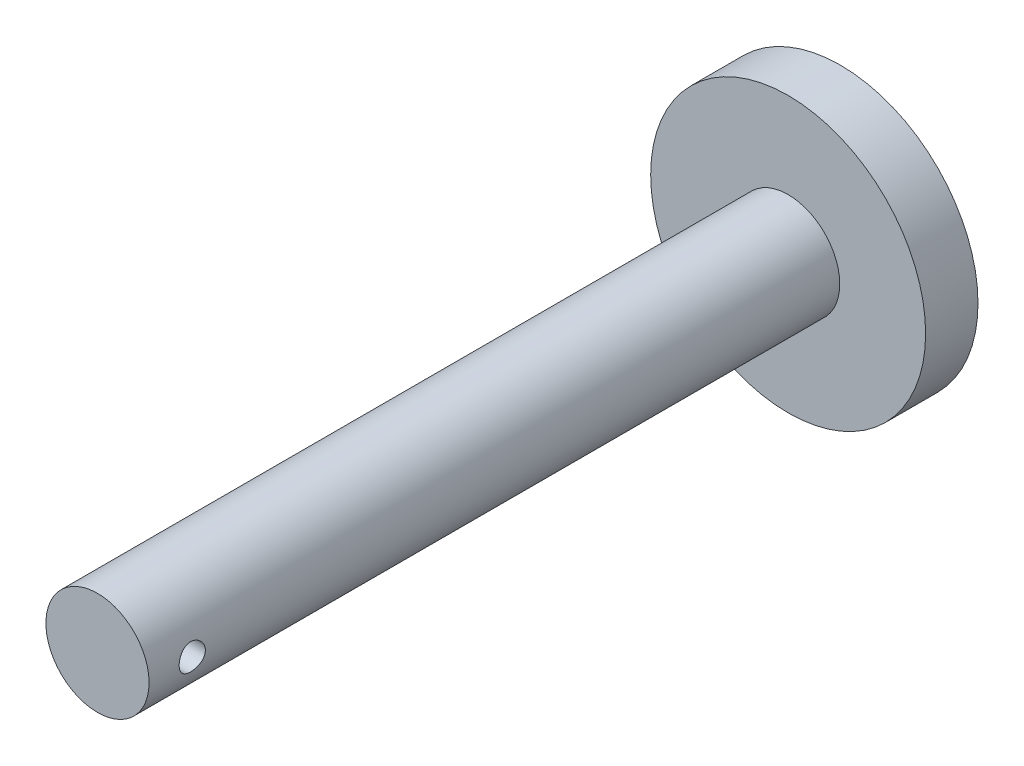
ISO-10303-21;
HEADER;
FILE_DESCRIPTION(('STEP AP214'),'2;1');
FILE_NAME('part.step','',(''),(''),'','','');
FILE_SCHEMA(('AUTOMOTIVE_DESIGN { 1 0 10303 214 1 1 1 1 }'));
ENDSEC;
DATA;
#1=APPLICATION_CONTEXT('core data for automotive mechanical design processes');
#2=APPLICATION_PROTOCOL_DEFINITION('international standard','automotive_design',2000,#1);
#3=PRODUCT_CONTEXT('',#1,'mechanical');
#4=PRODUCT('Part','Part','',(#3));
#5=PRODUCT_RELATED_PRODUCT_CATEGORY('part','',(#4));
#6=PRODUCT_DEFINITION_FORMATION('','',#4);
#7=PRODUCT_DEFINITION_CONTEXT('part definition',#1,'design');
#8=PRODUCT_DEFINITION('design','',#6,#7);
#9=PRODUCT_DEFINITION_SHAPE('','',#8);
#10=(LENGTH_UNIT() NAMED_UNIT(*) SI_UNIT(.MILLI.,.METRE.));
#11=(NAMED_UNIT(*) PLANE_ANGLE_UNIT() SI_UNIT($,.RADIAN.));
#12=(NAMED_UNIT(*) SI_UNIT($,.STERADIAN.) SOLID_ANGLE_UNIT());
#13=UNCERTAINTY_MEASURE_WITH_UNIT(LENGTH_MEASURE(1.E-05),#10,'distance_accuracy_value','');
#14=(GEOMETRIC_REPRESENTATION_CONTEXT(3) GLOBAL_UNCERTAINTY_ASSIGNED_CONTEXT((#13)) GLOBAL_UNIT_ASSIGNED_CONTEXT((#10,
#11,#12)) REPRESENTATION_CONTEXT('',''));
#15=CARTESIAN_POINT('',(0.,0.,0.));
#16=DIRECTION('',(0.,0.,1.));
#17=DIRECTION('',(1.,0.,0.));
#18=AXIS2_PLACEMENT_3D('',#15,#16,#17);
#19=CARTESIAN_POINT('',(0.000165779483992838,-0.000157565610184323,20309.6868082879));
#20=DIRECTION('',(0.,0.,-1.));
#21=DIRECTION('',(-1.,0.,0.));
#22=AXIS2_PLACEMENT_3D('',#19,#20,#21);
#23=CYLINDRICAL_SURFACE('',#22,7.88);
#24=CARTESIAN_POINT('',(0.000165779483992838,-0.000157565610184323,20309.6868082879));
#25=DIRECTION('',(0.,0.,1.));
#26=DIRECTION('',(1.,0.,0.));
#27=AXIS2_PLACEMENT_3D('',#24,#25,#26);
#28=CIRCLE('',#27,7.88);
#29=CARTESIAN_POINT('',(7.88016577948399,-0.000157565610184323,20309.6868082879));
#30=VERTEX_POINT('',#29);
#31=EDGE_CURVE('E60',#30,#30,#28,.T.);
#32=ORIENTED_EDGE('',*,*,#31,.F.);
#33=EDGE_LOOP('',(#32));
#34=FACE_BOUND('',#33,.T.);
#35=CARTESIAN_POINT('',(0.000165779483992838,-0.000157565610184323,20204.1868082879));
#36=DIRECTION('',(0.,0.,1.));
#37=DIRECTION('',(1.,0.,0.));
#38=AXIS2_PLACEMENT_3D('',#35,#36,#37);
#39=CIRCLE('',#38,7.88);
#40=CARTESIAN_POINT('',(7.88016577948399,-0.000157565610184323,20204.1868082879));
#41=VERTEX_POINT('',#40);
#42=EDGE_CURVE('E10',#41,#41,#39,.T.);
#43=ORIENTED_EDGE('',*,*,#42,.T.);
#44=EDGE_LOOP('',(#43));
#45=FACE_BOUND('',#44,.T.);
#46=CARTESIAN_POINT('',(7.88016577948399,-0.000157565610184323,20305.0868082879));
#47=CARTESIAN_POINT('',(7.8801639505477,-0.11060389295446,20305.0868052895));
#48=CARTESIAN_POINT('',(7.87782067920207,-0.221083395842065,20305.0776287398));
#49=CARTESIAN_POINT('',(7.868700075676,-0.438872419070673,20305.0412221994));
#50=CARTESIAN_POINT('',(7.86192031530747,-0.546180169806826,20305.0139823221));
#51=CARTESIAN_POINT('',(7.84467694111426,-0.754449477640841,20304.9423822201));
#52=CARTESIAN_POINT('',(7.83421782575516,-0.855418607632927,20304.8980428952));
#53=CARTESIAN_POINT('',(7.81072772562159,-1.04848603559215,20304.7935769453));
#54=CARTESIAN_POINT('',(7.79769663489274,-1.14058396787119,20304.7334496699));
#55=CARTESIAN_POINT('',(7.7701669908987,-1.3152450590804,20304.5977697663));
#56=CARTESIAN_POINT('',(7.7556452435888,-1.39759358895058,20304.5219455396));
#57=CARTESIAN_POINT('',(7.72692390425617,-1.54855236694292,20304.3576053948));
#58=CARTESIAN_POINT('',(7.71272434987646,-1.61716101703723,20304.2690880024));
#59=CARTESIAN_POINT('',(7.68602053200648,-1.73971015543918,20304.0801972938));
#60=CARTESIAN_POINT('',(7.67354567384372,-1.79340903147545,20303.9796626877));
#61=CARTESIAN_POINT('',(7.65204257439644,-1.88305998987957,20303.7706252483));
#62=CARTESIAN_POINT('',(7.64301376350046,-1.91901500549192,20303.6621237353));
#63=CARTESIAN_POINT('',(7.62966365966066,-1.97142246570708,20303.4425963372));
#64=CARTESIAN_POINT('',(7.62524918924553,-1.98826154700934,20303.3316685528));
#65=CARTESIAN_POINT('',(7.62134879948078,-2.00316369935246,20303.1084814174));
#66=CARTESIAN_POINT('',(7.62186205205088,-2.00122992508127,20302.9962222933));
#67=CARTESIAN_POINT('',(7.627675438462,-1.9789493972136,20302.7765344119));
#68=CARTESIAN_POINT('',(7.63285538134892,-1.95906493877917,20302.6690550898));
#69=CARTESIAN_POINT('',(7.64722675496454,-1.90218561248836,20302.4590101087));
#70=CARTESIAN_POINT('',(7.65641847927216,-1.86518949240256,20302.3564448098));
#71=CARTESIAN_POINT('',(7.67788701948207,-1.77474693847048,20302.1579074408));
#72=CARTESIAN_POINT('',(7.69019481860399,-1.72113400564288,20302.0620147096));
#73=CARTESIAN_POINT('',(7.71649142609444,-1.599096078945,20301.8804217516));
#74=CARTESIAN_POINT('',(7.73048053669731,-1.53066842018696,20301.794723363));
#75=CARTESIAN_POINT('',(7.75906832750519,-1.37855570373589,20301.6333042643));
#76=CARTESIAN_POINT('',(7.77367283214472,-1.29448094643592,20301.5579513442));
#77=CARTESIAN_POINT('',(7.80147512755084,-1.11471236454757,20301.4223431503));
#78=CARTESIAN_POINT('',(7.81467287270407,-1.01901816342064,20301.3620883659));
#79=CARTESIAN_POINT('',(7.83824362865038,-0.818192353623417,20301.2582458564));
#80=CARTESIAN_POINT('',(7.84860621793596,-0.71302776662787,20301.2147193904));
#81=CARTESIAN_POINT('',(7.86526340732067,-0.49655220250099,20301.1460664058));
#82=CARTESIAN_POINT('',(7.8715588101432,-0.385242442926588,20301.1209362563));
#83=CARTESIAN_POINT('',(7.87925293311794,-0.162779463350305,20301.0903544652));
#84=CARTESIAN_POINT('',(7.88077620790448,-0.0516992759932855,20301.0844021532));
#85=CARTESIAN_POINT('',(7.87910994445882,0.16987050825311,20301.0909696851));
#86=CARTESIAN_POINT('',(7.87592084437138,0.280360159090502,20301.1034878116));
#87=CARTESIAN_POINT('',(7.86526812603708,0.495862145796184,20301.1462286159));
#88=CARTESIAN_POINT('',(7.85787082226189,0.600932500356216,20301.1761767894));
#89=CARTESIAN_POINT('',(7.83963655659401,0.80455153022279,20301.2526128589));
#90=CARTESIAN_POINT('',(7.82879924129123,0.903099534197,20301.2991024543));
#91=CARTESIAN_POINT('',(7.80459019068577,1.09285807261905,20301.4082626783));
#92=CARTESIAN_POINT('',(7.79117598774214,1.1839027744315,20301.4712119351));
#93=CARTESIAN_POINT('',(7.76336582823959,1.35431381311217,20301.6111497638));
#94=CARTESIAN_POINT('',(7.74896969705962,1.4336780648236,20301.6881408371));
#95=CARTESIAN_POINT('',(7.72036761637792,1.58054906572546,20301.8563042682));
#96=CARTESIAN_POINT('',(7.70617574527498,1.64770412214792,20301.9477867126));
#97=CARTESIAN_POINT('',(7.67999498580157,1.76571081443749,20302.1410164365));
#98=CARTESIAN_POINT('',(7.668006000471,1.81656316794209,20302.2427632639));
#99=CARTESIAN_POINT('',(7.64772211415523,1.90014043370978,20302.4530941167));
#100=CARTESIAN_POINT('',(7.63940542426869,1.93297255624245,20302.5616333288));
#101=CARTESIAN_POINT('',(7.62739004612696,1.97985423335701,20302.7829354134));
#102=CARTESIAN_POINT('',(7.62369031073617,1.99390804695257,20302.8956973222));
#103=CARTESIAN_POINT('',(7.62140928629254,2.00260652406708,20303.1186603322));
#104=CARTESIAN_POINT('',(7.62267957705745,1.99781397552431,20303.228838305));
#105=CARTESIAN_POINT('',(7.62985135087338,1.97024769660075,20303.4467598908));
#106=CARTESIAN_POINT('',(7.63575273525955,1.94747434929852,20303.5545035557));
#107=CARTESIAN_POINT('',(7.65143775831948,1.88490462404311,20303.7638646678));
#108=CARTESIAN_POINT('',(7.66119659749916,1.84521686346384,20303.8655165629));
#109=CARTESIAN_POINT('',(7.68349976303871,1.75003038756696,20304.0607925577));
#110=CARTESIAN_POINT('',(7.69604448732491,1.69452941322304,20304.154415508));
#111=CARTESIAN_POINT('',(7.7229265881556,1.56754074672777,20304.3336881936));
#112=CARTESIAN_POINT('',(7.73730304001701,1.49566398142429,20304.4190565114));
#113=CARTESIAN_POINT('',(7.76599891836162,1.33871818854384,20304.576703082));
#114=CARTESIAN_POINT('',(7.78031833042098,1.25364601756355,20304.6489782068));
#115=CARTESIAN_POINT('',(7.80760855419452,1.07079142643727,20304.779715915));
#116=CARTESIAN_POINT('',(7.82054890394318,0.972799883569238,20304.837892864));
#117=CARTESIAN_POINT('',(7.84329909953431,0.768106581896936,20304.9368551137));
#118=CARTESIAN_POINT('',(7.85311113572446,0.661410983427605,20304.9776525898));
#119=CARTESIAN_POINT('',(7.86708879772856,0.462432112320536,20305.0348045617));
#120=CARTESIAN_POINT('',(7.87195852977112,0.371077439371159,20305.0542631188));
#121=CARTESIAN_POINT('',(7.87849766507626,0.186437111928176,20305.0802657314));
#122=CARTESIAN_POINT('',(7.88016732463762,0.0931516126824051,20305.0868108212));
#123=CARTESIAN_POINT('',(7.88016577948399,-0.000157565610184323,20305.0868082879));
#124=B_SPLINE_CURVE_WITH_KNOTS('',3,(#46,#47,#48,#49,#50,#51,#52,#53,#54,#55,#56,#57,#58,#59,
#60,#61,#62,#63,#64,#65,#66,#67,#68,#69,#70,#71,#72,#73,#74,#75,#76,#77,#78,#79,#80,#81,#82,#83,
#84,#85,#86,#87,#88,#89,#90,#91,#92,#93,#94,#95,#96,#97,#98,#99,#100,#101,#102,#103,#104,#105,
#106,#107,#108,#109,#110,#111,#112,#113,#114,#115,#116,#117,#118,#119,#120,#121,#122,#123),
.UNSPECIFIED.,.T.,.F.,(4,2,2,2,2,2,2,2,2,2,2,2,2,2,2,2,2,2,2,2,2,2,2,2,2,2,2,2,2,2,2,2,2,2,2,2,
2,2,4),(0.,0.330996984017648,0.662175281664649,0.99295007221282,1.32373849211415,
1.66081750016805,1.99793568972977,2.34023447620484,2.68247665816356,3.01766596186309,
3.35279893958984,3.67953979502001,4.0063045650922,4.33645554552678,4.66666596326695,
5.00659274627279,5.34653054785383,5.68770160390691,6.02880530388397,6.36092853645745,
6.69302089099087,7.02001948669635,7.34705168752963,7.68002532360291,8.01305832915785,
8.35453589856561,8.69599843422306,9.03540680837821,9.37473818995554,9.70401457654512,
10.0332839481337,10.3604700129934,10.6877028420881,11.0237178895982,11.3598131057395,
11.7022353217701,12.0444172552143,12.3240782568286,12.6037168590226),.UNSPECIFIED.);
#125=CARTESIAN_POINT('',(7.88016577948399,-0.000157565610184323,20305.0868082879));
#126=VERTEX_POINT('',#125);
#127=EDGE_CURVE('E63',#126,#126,#124,.T.);
#128=ORIENTED_EDGE('',*,*,#127,.F.);
#129=EDGE_LOOP('',(#128));
#130=FACE_BOUND('',#129,.T.);
#131=CARTESIAN_POINT('',(-7.87983422051601,-0.000157565610184323,20305.0868082879));
#132=CARTESIAN_POINT('',(-7.87983239157971,0.110288761734091,20305.0868052895));
#133=CARTESIAN_POINT('',(-7.87748912023409,0.220768264621696,20305.0776287398));
#134=CARTESIAN_POINT('',(-7.86836851670801,0.438557287850305,20305.0412221994));
#135=CARTESIAN_POINT('',(-7.86158875633948,0.545865038586457,20305.0139823221));
#136=CARTESIAN_POINT('',(-7.84434538214628,0.754134346420472,20304.9423822201));
#137=CARTESIAN_POINT('',(-7.83388626678717,0.855103476412558,20304.8980428952));
#138=CARTESIAN_POINT('',(-7.81039616665361,1.04817090437179,20304.7935769453));
#139=CARTESIAN_POINT('',(-7.79736507592476,1.14026883665082,20304.7334496699));
#140=CARTESIAN_POINT('',(-7.76983543193072,1.31492992786003,20304.5977697663));
#141=CARTESIAN_POINT('',(-7.75531368462081,1.39727845773021,20304.5219455396));
#142=CARTESIAN_POINT('',(-7.72659234528818,1.54823723572255,20304.3576053948));
#143=CARTESIAN_POINT('',(-7.71239279090847,1.61684588581687,20304.2690880024));
#144=CARTESIAN_POINT('',(-7.6856889730385,1.73939502421882,20304.0801972938));
#145=CARTESIAN_POINT('',(-7.67321411487573,1.79309390025508,20303.9796626877));
#146=CARTESIAN_POINT('',(-7.65171101542845,1.88274485865921,20303.7706252483));
#147=CARTESIAN_POINT('',(-7.64268220453248,1.91869987427155,20303.6621237353));
#148=CARTESIAN_POINT('',(-7.62933210069268,1.97110733448671,20303.4425963372));
#149=CARTESIAN_POINT('',(-7.62491763027755,1.98794641578897,20303.3316685528));
#150=CARTESIAN_POINT('',(-7.62101724051279,2.0028485681321,20303.1084814174));
#151=CARTESIAN_POINT('',(-7.62153049308289,2.00091479386091,20302.9962222933));
#152=CARTESIAN_POINT('',(-7.62734387949401,1.97863426599324,20302.7765344119));
#153=CARTESIAN_POINT('',(-7.63252382238094,1.9587498075588,20302.6690550898));
#154=CARTESIAN_POINT('',(-7.64689519599656,1.90187048126799,20302.4590101087));
#155=CARTESIAN_POINT('',(-7.65608692030417,1.86487436118219,20302.3564448098));
#156=CARTESIAN_POINT('',(-7.67755546051409,1.77443180725011,20302.1579074408));
#157=CARTESIAN_POINT('',(-7.689863259636,1.72081887442251,20302.0620147096));
#158=CARTESIAN_POINT('',(-7.71615986712646,1.59878094772463,20301.8804217516));
#159=CARTESIAN_POINT('',(-7.73014897772933,1.53035328896659,20301.794723363));
#160=CARTESIAN_POINT('',(-7.7587367685372,1.37824057251553,20301.6333042643));
#161=CARTESIAN_POINT('',(-7.77334127317673,1.29416581521555,20301.5579513442));
#162=CARTESIAN_POINT('',(-7.80114356858285,1.1143972333272,20301.4223431503));
#163=CARTESIAN_POINT('',(-7.81434131373608,1.01870303220027,20301.3620883659));
#164=CARTESIAN_POINT('',(-7.83791206968239,0.817877222403049,20301.2582458564));
#165=CARTESIAN_POINT('',(-7.84827465896797,0.712712635407502,20301.2147193904));
#166=CARTESIAN_POINT('',(-7.86493184835268,0.496237071280622,20301.1460664058));
#167=CARTESIAN_POINT('',(-7.87122725117521,0.384927311706219,20301.1209362563));
#168=CARTESIAN_POINT('',(-7.87892137414995,0.162464332129937,20301.0903544652));
#169=CARTESIAN_POINT('',(-7.8804446489365,0.0513841447729169,20301.0844021532));
#170=CARTESIAN_POINT('',(-7.87877838549084,-0.170185639473479,20301.0909696851));
#171=CARTESIAN_POINT('',(-7.87558928540339,-0.28067529031087,20301.1034878116));
#172=CARTESIAN_POINT('',(-7.8649365670691,-0.496177277016553,20301.1462286159));
#173=CARTESIAN_POINT('',(-7.8575392632939,-0.601247631576584,20301.1761767894));
#174=CARTESIAN_POINT('',(-7.83930499762602,-0.804866661443158,20301.2526128589));
#175=CARTESIAN_POINT('',(-7.82846768232325,-0.903414665417368,20301.2991024543));
#176=CARTESIAN_POINT('',(-7.80425863171778,-1.09317320383941,20301.4082626783));
#177=CARTESIAN_POINT('',(-7.79084442877415,-1.18421790565187,20301.4712119351));
#178=CARTESIAN_POINT('',(-7.76303426927161,-1.35462894433254,20301.6111497638));
#179=CARTESIAN_POINT('',(-7.74863813809163,-1.43399319604396,20301.6881408371));
#180=CARTESIAN_POINT('',(-7.72003605740994,-1.58086419694583,20301.8563042682));
#181=CARTESIAN_POINT('',(-7.70584418630699,-1.64801925336829,20301.9477867126));
#182=CARTESIAN_POINT('',(-7.67966342683358,-1.76602594565786,20302.1410164365));
#183=CARTESIAN_POINT('',(-7.66767444150301,-1.81687829916246,20302.2427632639));
#184=CARTESIAN_POINT('',(-7.64739055518725,-1.90045556493015,20302.4530941167));
#185=CARTESIAN_POINT('',(-7.6390738653007,-1.93328768746282,20302.5616333288));
#186=CARTESIAN_POINT('',(-7.62705848715898,-1.98016936457738,20302.7829354134));
#187=CARTESIAN_POINT('',(-7.62335875176818,-1.99422317817294,20302.8956973222));
#188=CARTESIAN_POINT('',(-7.62107772732455,-2.00292165528745,20303.1186603322));
#189=CARTESIAN_POINT('',(-7.62234801808946,-1.99812910674468,20303.228838305));
#190=CARTESIAN_POINT('',(-7.6295197919054,-1.97056282782112,20303.4467598908));
#191=CARTESIAN_POINT('',(-7.63542117629156,-1.94778948051889,20303.5545035557));
#192=CARTESIAN_POINT('',(-7.65110619935149,-1.88521975526348,20303.7638646678));
#193=CARTESIAN_POINT('',(-7.66086503853117,-1.84553199468421,20303.8655165629));
#194=CARTESIAN_POINT('',(-7.68316820407072,-1.75034551878733,20304.0607925577));
#195=CARTESIAN_POINT('',(-7.69571292835692,-1.69484454444341,20304.154415508));
#196=CARTESIAN_POINT('',(-7.72259502918761,-1.56785587794814,20304.3336881936));
#197=CARTESIAN_POINT('',(-7.73697148104902,-1.49597911264466,20304.4190565114));
#198=CARTESIAN_POINT('',(-7.76566735939364,-1.33903331976421,20304.576703082));
#199=CARTESIAN_POINT('',(-7.77998677145299,-1.25396114878392,20304.6489782068));
#200=CARTESIAN_POINT('',(-7.80727699522653,-1.07110655765764,20304.779715915));
#201=CARTESIAN_POINT('',(-7.82021734497519,-0.973115014789607,20304.837892864));
#202=CARTESIAN_POINT('',(-7.84296754056633,-0.768421713117305,20304.9368551137));
#203=CARTESIAN_POINT('',(-7.85277957675648,-0.661726114647974,20304.9776525898));
#204=CARTESIAN_POINT('',(-7.86675723876058,-0.462747243540905,20305.0348045617));
#205=CARTESIAN_POINT('',(-7.87162697080313,-0.371392570591527,20305.0542631188));
#206=CARTESIAN_POINT('',(-7.87816610610827,-0.186752243148545,20305.0802657314));
#207=CARTESIAN_POINT('',(-7.87983576566963,-0.0934667439027738,20305.0868108212));
#208=CARTESIAN_POINT('',(-7.87983422051601,-0.000157565610184323,20305.0868082879));
#209=B_SPLINE_CURVE_WITH_KNOTS('',3,(#131,#132,#133,#134,#135,#136,#137,#138,#139,#140,#141,
#142,#143,#144,#145,#146,#147,#148,#149,#150,#151,#152,#153,#154,#155,#156,#157,#158,#159,#160,
#161,#162,#163,#164,#165,#166,#167,#168,#169,#170,#171,#172,#173,#174,#175,#176,#177,#178,#179,
#180,#181,#182,#183,#184,#185,#186,#187,#188,#189,#190,#191,#192,#193,#194,#195,#196,#197,#198,
#199,#200,#201,#202,#203,#204,#205,#206,#207,#208),.UNSPECIFIED.,.T.,.F.,(4,2,2,2,2,2,2,2,2,2,2,
2,2,2,2,2,2,2,2,2,2,2,2,2,2,2,2,2,2,2,2,2,2,2,2,2,2,2,4),(0.,0.330996984017648,
0.662175281664649,0.99295007221282,1.32373849211415,1.66081750016805,1.99793568972977,
2.34023447620484,2.68247665816356,3.01766596186309,3.35279893958984,3.67953979502001,
4.0063045650922,4.33645554552678,4.66666596326695,5.00659274627279,5.34653054785383,
5.68770160390691,6.02880530388397,6.36092853645745,6.69302089099087,7.02001948669635,
7.34705168752963,7.68002532360291,8.01305832915785,8.35453589856561,8.69599843422306,
9.03540680837821,9.37473818995554,9.70401457654512,10.0332839481337,10.3604700129934,
10.6877028420881,11.0237178895982,11.3598131057395,11.7022353217701,12.0444172552143,
12.3240782568286,12.6037168590226),.UNSPECIFIED.);
#210=CARTESIAN_POINT('',(-7.87983422051601,-0.000157565610184323,20305.0868082879));
#211=VERTEX_POINT('',#210);
#212=EDGE_CURVE('E43',#211,#211,#209,.T.);
#213=ORIENTED_EDGE('',*,*,#212,.F.);
#214=EDGE_LOOP('',(#213));
#215=FACE_BOUND('',#214,.T.);
#216=ADVANCED_FACE('F39',(#34,#45,#130,#215),#23,.T.);
#217=CARTESIAN_POINT('',(0.000165779483992838,-0.000157565610184323,20204.1868082879));
#218=DIRECTION('',(0.,0.,-1.));
#219=DIRECTION('',(-1.,0.,0.));
#220=AXIS2_PLACEMENT_3D('',#217,#218,#219);
#221=CYLINDRICAL_SURFACE('',#220,20.9999997566387);
#222=CARTESIAN_POINT('',(0.000165779483992838,-0.000157565610184323,20204.1868082879));
#223=DIRECTION('',(0.,0.,-1.));
#224=DIRECTION('',(-1.,0.,0.));
#225=AXIS2_PLACEMENT_3D('',#222,#223,#224);
#226=CIRCLE('',#225,20.9999997566387);
#227=CARTESIAN_POINT('',(-20.9998339771547,-0.000157565610184323,20204.1868082879));
#228=VERTEX_POINT('',#227);
#229=EDGE_CURVE('E52',#228,#228,#226,.T.);
#230=ORIENTED_EDGE('',*,*,#229,.T.);
#231=EDGE_LOOP('',(#230));
#232=FACE_BOUND('',#231,.T.);
#233=CARTESIAN_POINT('',(0.000165779483992838,-0.000157565610184323,20196.1868082879));
#234=DIRECTION('',(0.,0.,-1.));
#235=DIRECTION('',(-1.,0.,0.));
#236=AXIS2_PLACEMENT_3D('',#233,#234,#235);
#237=CIRCLE('',#236,20.9999997566387);
#238=CARTESIAN_POINT('',(-20.9998339771547,-0.000157565610184323,20196.1868082879));
#239=VERTEX_POINT('',#238);
#240=EDGE_CURVE('E57',#239,#239,#237,.T.);
#241=ORIENTED_EDGE('',*,*,#240,.F.);
#242=EDGE_LOOP('',(#241));
#243=FACE_BOUND('',#242,.T.);
#244=ADVANCED_FACE('F41',(#232,#243),#221,.T.);
#245=CARTESIAN_POINT('',(0.000165779483992838,-0.000157565610184323,20204.1868082879));
#246=DIRECTION('',(0.,0.,-1.));
#247=DIRECTION('',(-1.,0.,0.));
#248=AXIS2_PLACEMENT_3D('',#245,#246,#247);
#249=PLANE('',#248);
#250=ORIENTED_EDGE('',*,*,#42,.F.);
#251=EDGE_LOOP('',(#250));
#252=FACE_BOUND('',#251,.T.);
#253=ORIENTED_EDGE('',*,*,#229,.F.);
#254=EDGE_LOOP('',(#253));
#255=FACE_BOUND('',#254,.T.);
#256=ADVANCED_FACE('F83',(#252,#255),#249,.F.);
#257=CARTESIAN_POINT('',(0.000165779483992838,-0.000157565610184323,20196.1868082879));
#258=DIRECTION('',(0.,0.,-1.));
#259=DIRECTION('',(-1.,0.,0.));
#260=AXIS2_PLACEMENT_3D('',#257,#258,#259);
#261=PLANE('',#260);
#262=ORIENTED_EDGE('',*,*,#240,.T.);
#263=EDGE_LOOP('',(#262));
#264=FACE_BOUND('',#263,.T.);
#265=ADVANCED_FACE('F78',(#264),#261,.T.);
#266=CARTESIAN_POINT('',(0.000165779483992838,-0.000157565610184323,20309.6868082879));
#267=DIRECTION('',(0.,0.,1.));
#268=DIRECTION('',(1.,0.,0.));
#269=AXIS2_PLACEMENT_3D('',#266,#267,#268);
#270=PLANE('',#269);
#271=ORIENTED_EDGE('',*,*,#31,.T.);
#272=EDGE_LOOP('',(#271));
#273=FACE_BOUND('',#272,.T.);
#274=ADVANCED_FACE('F74',(#273),#270,.T.);
#275=CARTESIAN_POINT('',(-11.427606906117,-0.000157565610184323,20303.0868082879));
#276=DIRECTION('',(-1.,0.,0.));
#277=DIRECTION('',(0.,0.,1.));
#278=AXIS2_PLACEMENT_3D('',#275,#276,#277);
#279=CYLINDRICAL_SURFACE('',#278,2.);
#280=ORIENTED_EDGE('',*,*,#127,.T.);
#281=EDGE_LOOP('',(#280));
#282=FACE_BOUND('',#281,.T.);
#283=ORIENTED_EDGE('',*,*,#212,.T.);
#284=EDGE_LOOP('',(#283));
#285=FACE_BOUND('',#284,.T.);
#286=ADVANCED_FACE('F71',(#282,#285),#279,.F.);
#287=CLOSED_SHELL('',(#216,#244,#256,#265,#274,#286));
#288=MANIFOLD_SOLID_BREP('B2',#287);
#289=ADVANCED_BREP_SHAPE_REPRESENTATION('',(#18,#288),#14);
#290=SHAPE_DEFINITION_REPRESENTATION(#9,#289);
ENDSEC;
END-ISO-10303-21;
